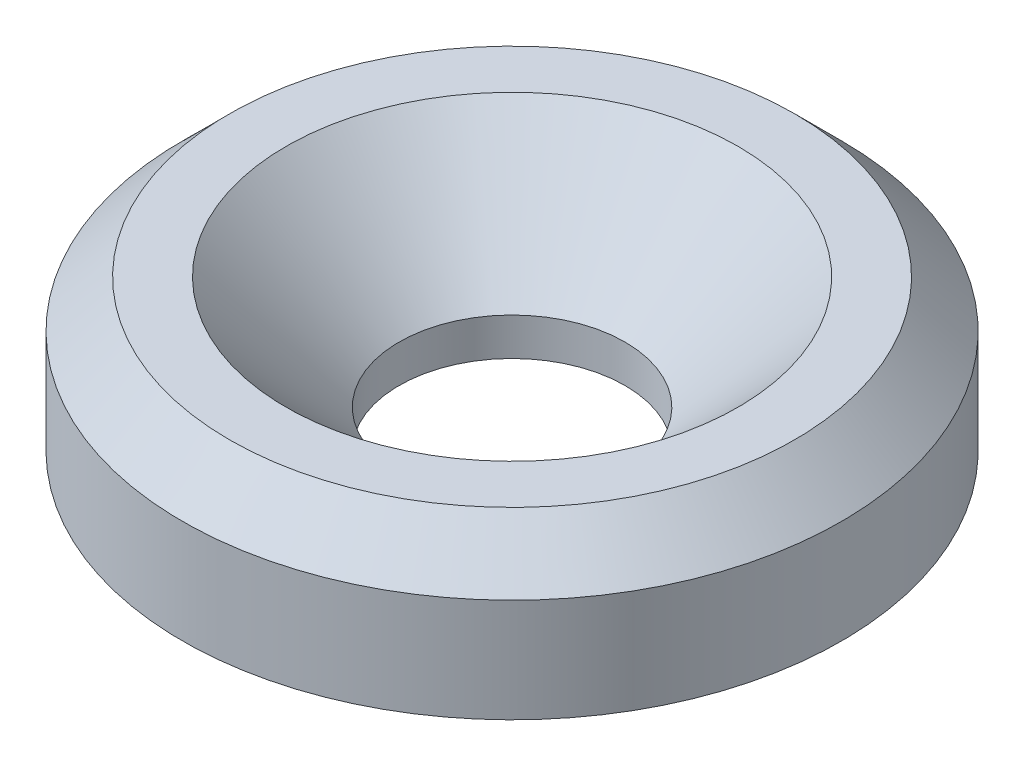
ISO-10303-21;
HEADER;
FILE_DESCRIPTION(('STEP AP214'),'2;1');
FILE_NAME('part.step','',(''),(''),'','','');
FILE_SCHEMA(('AUTOMOTIVE_DESIGN { 1 0 10303 214 1 1 1 1 }'));
ENDSEC;
DATA;
#1=APPLICATION_CONTEXT('core data for automotive mechanical design processes');
#2=APPLICATION_PROTOCOL_DEFINITION('international standard','automotive_design',2000,#1);
#3=PRODUCT_CONTEXT('',#1,'mechanical');
#4=PRODUCT('Part','Part','',(#3));
#5=PRODUCT_RELATED_PRODUCT_CATEGORY('part','',(#4));
#6=PRODUCT_DEFINITION_FORMATION('','',#4);
#7=PRODUCT_DEFINITION_CONTEXT('part definition',#1,'design');
#8=PRODUCT_DEFINITION('design','',#6,#7);
#9=PRODUCT_DEFINITION_SHAPE('','',#8);
#10=(LENGTH_UNIT() NAMED_UNIT(*) SI_UNIT(.MILLI.,.METRE.));
#11=(NAMED_UNIT(*) PLANE_ANGLE_UNIT() SI_UNIT($,.RADIAN.));
#12=(NAMED_UNIT(*) SI_UNIT($,.STERADIAN.) SOLID_ANGLE_UNIT());
#13=UNCERTAINTY_MEASURE_WITH_UNIT(LENGTH_MEASURE(1.E-05),#10,'distance_accuracy_value','');
#14=(GEOMETRIC_REPRESENTATION_CONTEXT(3) GLOBAL_UNCERTAINTY_ASSIGNED_CONTEXT((#13)) GLOBAL_UNIT_ASSIGNED_CONTEXT((#10,
#11,#12)) REPRESENTATION_CONTEXT('',''));
#15=CARTESIAN_POINT('',(0.,0.,0.));
#16=DIRECTION('',(0.,0.,1.));
#17=DIRECTION('',(1.,0.,0.));
#18=AXIS2_PLACEMENT_3D('',#15,#16,#17);
#19=CARTESIAN_POINT('',(-17.5,0.,0.));
#20=DIRECTION('',(0.,1.,0.));
#21=DIRECTION('',(0.,0.,1.));
#22=AXIS2_PLACEMENT_3D('',#19,#20,#21);
#23=PLANE('',#22);
#24=CARTESIAN_POINT('',(0.,0.,0.));
#25=DIRECTION('',(0.,-1.,0.));
#26=DIRECTION('',(0.,0.,-1.));
#27=AXIS2_PLACEMENT_3D('',#24,#25,#26);
#28=CIRCLE('',#27,6.);
#29=CARTESIAN_POINT('',(0.,0.,-6.));
#30=VERTEX_POINT('',#29);
#31=EDGE_CURVE('E59',#30,#30,#28,.T.);
#32=ORIENTED_EDGE('',*,*,#31,.F.);
#33=EDGE_LOOP('',(#32));
#34=FACE_BOUND('',#33,.T.);
#35=CARTESIAN_POINT('',(0.,0.,0.));
#36=DIRECTION('',(0.,-1.,0.));
#37=DIRECTION('',(0.,0.,-1.));
#38=AXIS2_PLACEMENT_3D('',#35,#36,#37);
#39=CIRCLE('',#38,17.5);
#40=CARTESIAN_POINT('',(0.,0.,-17.5));
#41=VERTEX_POINT('',#40);
#42=EDGE_CURVE('E74',#41,#41,#39,.T.);
#43=ORIENTED_EDGE('',*,*,#42,.T.);
#44=EDGE_LOOP('',(#43));
#45=FACE_BOUND('',#44,.T.);
#46=ADVANCED_FACE('F45',(#34,#45),#23,.F.);
#47=CARTESIAN_POINT('',(0.,0.,0.));
#48=DIRECTION('',(0.,-1.,0.));
#49=DIRECTION('',(0.,0.,-1.));
#50=AXIS2_PLACEMENT_3D('',#47,#48,#49);
#51=CYLINDRICAL_SURFACE('',#50,6.);
#52=CARTESIAN_POINT('',(0.,2.,0.));
#53=DIRECTION('',(0.,-1.,0.));
#54=DIRECTION('',(0.,0.,-1.));
#55=AXIS2_PLACEMENT_3D('',#52,#53,#54);
#56=CIRCLE('',#55,6.);
#57=CARTESIAN_POINT('',(0.,2.,-6.));
#58=VERTEX_POINT('',#57);
#59=EDGE_CURVE('E64',#58,#58,#56,.T.);
#60=ORIENTED_EDGE('',*,*,#59,.F.);
#61=EDGE_LOOP('',(#60));
#62=FACE_BOUND('',#61,.T.);
#63=ORIENTED_EDGE('',*,*,#31,.T.);
#64=EDGE_LOOP('',(#63));
#65=FACE_BOUND('',#64,.T.);
#66=ADVANCED_FACE('F92',(#62,#65),#51,.F.);
#67=CARTESIAN_POINT('',(0.,2.,0.));
#68=DIRECTION('',(0.,1.,0.));
#69=DIRECTION('',(0.,0.,1.));
#70=AXIS2_PLACEMENT_3D('',#67,#68,#69);
#71=CONICAL_SURFACE('',#70,6.,0.78539816339745);
#72=CARTESIAN_POINT('',(0.,8.,0.));
#73=DIRECTION('',(0.,-1.,0.));
#74=DIRECTION('',(0.,0.,-1.));
#75=AXIS2_PLACEMENT_3D('',#72,#73,#74);
#76=CIRCLE('',#75,12.);
#77=CARTESIAN_POINT('',(0.,8.,-12.));
#78=VERTEX_POINT('',#77);
#79=EDGE_CURVE('E70',#78,#78,#76,.T.);
#80=ORIENTED_EDGE('',*,*,#79,.F.);
#81=EDGE_LOOP('',(#80));
#82=FACE_BOUND('',#81,.T.);
#83=ORIENTED_EDGE('',*,*,#59,.T.);
#84=EDGE_LOOP('',(#83));
#85=FACE_BOUND('',#84,.T.);
#86=ADVANCED_FACE('F89',(#82,#85),#71,.F.);
#87=CARTESIAN_POINT('',(-12.,8.,0.));
#88=DIRECTION('',(0.,-1.,0.));
#89=DIRECTION('',(0.,0.,-1.));
#90=AXIS2_PLACEMENT_3D('',#87,#88,#89);
#91=PLANE('',#90);
#92=CARTESIAN_POINT('',(0.,8.,0.));
#93=DIRECTION('',(0.,-1.,0.));
#94=DIRECTION('',(0.,0.,-1.));
#95=AXIS2_PLACEMENT_3D('',#92,#93,#94);
#96=CIRCLE('',#95,15.);
#97=CARTESIAN_POINT('',(0.,8.,-15.));
#98=VERTEX_POINT('',#97);
#99=EDGE_CURVE('E10',#98,#98,#96,.F.);
#100=ORIENTED_EDGE('',*,*,#99,.T.);
#101=EDGE_LOOP('',(#100));
#102=FACE_BOUND('',#101,.T.);
#103=ORIENTED_EDGE('',*,*,#79,.T.);
#104=EDGE_LOOP('',(#103));
#105=FACE_BOUND('',#104,.T.);
#106=ADVANCED_FACE('F82',(#102,#105),#91,.F.);
#107=CARTESIAN_POINT('',(0.,0.,0.));
#108=DIRECTION('',(0.,-1.,0.));
#109=DIRECTION('',(0.,0.,-1.));
#110=AXIS2_PLACEMENT_3D('',#107,#108,#109);
#111=CYLINDRICAL_SURFACE('',#110,17.5);
#112=CARTESIAN_POINT('',(0.,5.50000000000001,0.));
#113=DIRECTION('',(0.,-1.,0.));
#114=DIRECTION('',(0.,0.,-1.));
#115=AXIS2_PLACEMENT_3D('',#112,#113,#114);
#116=CIRCLE('',#115,17.5);
#117=CARTESIAN_POINT('',(0.,5.50000000000001,-17.5));
#118=VERTEX_POINT('',#117);
#119=EDGE_CURVE('E54',#118,#118,#116,.T.);
#120=ORIENTED_EDGE('',*,*,#119,.T.);
#121=EDGE_LOOP('',(#120));
#122=FACE_BOUND('',#121,.T.);
#123=ORIENTED_EDGE('',*,*,#42,.F.);
#124=EDGE_LOOP('',(#123));
#125=FACE_BOUND('',#124,.T.);
#126=ADVANCED_FACE('F80',(#122,#125),#111,.T.);
#127=CARTESIAN_POINT('',(0.,5.50000000000001,0.));
#128=DIRECTION('',(0.,-1.,0.));
#129=DIRECTION('',(0.,0.,-1.));
#130=AXIS2_PLACEMENT_3D('',#127,#128,#129);
#131=CONICAL_SURFACE('',#130,17.5,0.78539816339745);
#132=ORIENTED_EDGE('',*,*,#99,.F.);
#133=EDGE_LOOP('',(#132));
#134=FACE_BOUND('',#133,.T.);
#135=ORIENTED_EDGE('',*,*,#119,.F.);
#136=EDGE_LOOP('',(#135));
#137=FACE_BOUND('',#136,.T.);
#138=ADVANCED_FACE('F48',(#134,#137),#131,.T.);
#139=CLOSED_SHELL('',(#46,#66,#86,#106,#126,#138));
#140=MANIFOLD_SOLID_BREP('B2',#139);
#141=ADVANCED_BREP_SHAPE_REPRESENTATION('',(#18,#140),#14);
#142=SHAPE_DEFINITION_REPRESENTATION(#9,#141);
ENDSEC;
END-ISO-10303-21;
